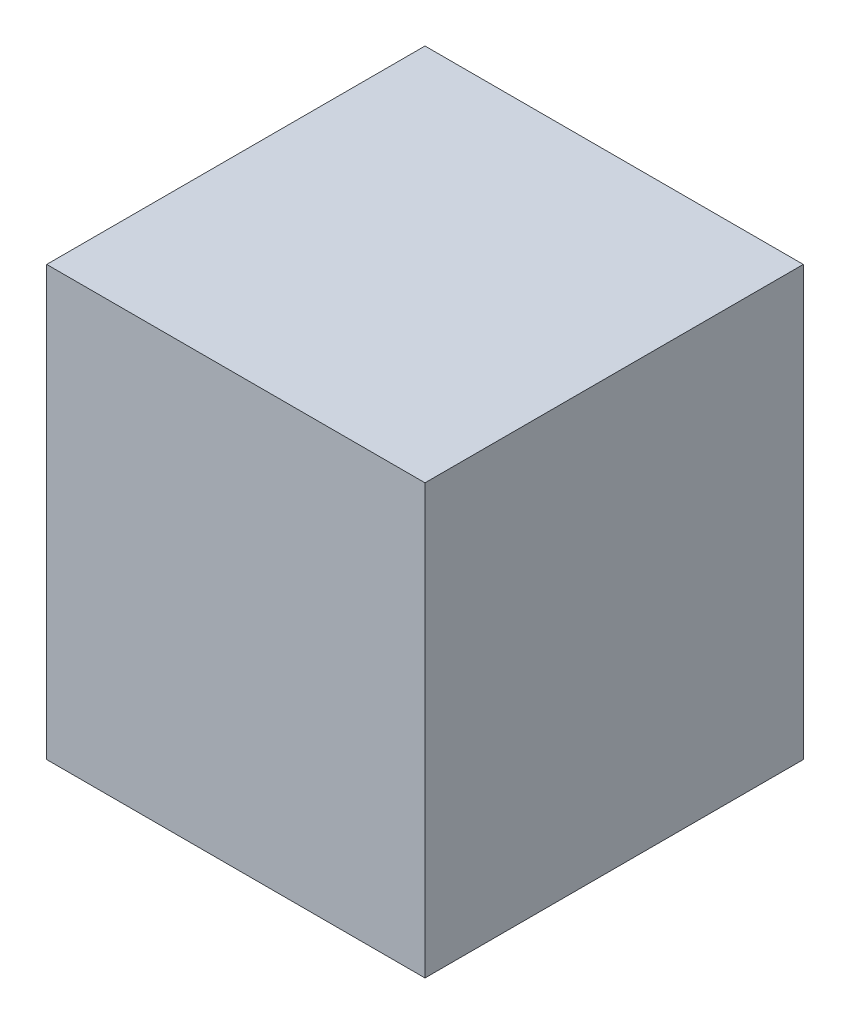
ISO-10303-21;
HEADER;
FILE_DESCRIPTION(('STEP AP214'),'2;1');
FILE_NAME('part.step','',(''),(''),'','','');
FILE_SCHEMA(('AUTOMOTIVE_DESIGN { 1 0 10303 214 1 1 1 1 }'));
ENDSEC;
DATA;
#1=APPLICATION_CONTEXT('core data for automotive mechanical design processes');
#2=APPLICATION_PROTOCOL_DEFINITION('international standard','automotive_design',2000,#1);
#3=PRODUCT_CONTEXT('',#1,'mechanical');
#4=PRODUCT('Part','Part','',(#3));
#5=PRODUCT_RELATED_PRODUCT_CATEGORY('part','',(#4));
#6=PRODUCT_DEFINITION_FORMATION('','',#4);
#7=PRODUCT_DEFINITION_CONTEXT('part definition',#1,'design');
#8=PRODUCT_DEFINITION('design','',#6,#7);
#9=PRODUCT_DEFINITION_SHAPE('','',#8);
#10=(LENGTH_UNIT() NAMED_UNIT(*) SI_UNIT(.MILLI.,.METRE.));
#11=(NAMED_UNIT(*) PLANE_ANGLE_UNIT() SI_UNIT($,.RADIAN.));
#12=(NAMED_UNIT(*) SI_UNIT($,.STERADIAN.) SOLID_ANGLE_UNIT());
#13=UNCERTAINTY_MEASURE_WITH_UNIT(LENGTH_MEASURE(1.E-05),#10,'distance_accuracy_value','');
#14=(GEOMETRIC_REPRESENTATION_CONTEXT(3) GLOBAL_UNCERTAINTY_ASSIGNED_CONTEXT((#13)) GLOBAL_UNIT_ASSIGNED_CONTEXT((#10,
#11,#12)) REPRESENTATION_CONTEXT('',''));
#15=CARTESIAN_POINT('',(0.,0.,0.));
#16=DIRECTION('',(0.,0.,1.));
#17=DIRECTION('',(1.,0.,0.));
#18=AXIS2_PLACEMENT_3D('',#15,#16,#17);
#19=CARTESIAN_POINT('',(2.5,2.834,2.5));
#20=DIRECTION('',(-1.,0.,0.));
#21=DIRECTION('',(0.,0.,1.));
#22=AXIS2_PLACEMENT_3D('',#19,#20,#21);
#23=PLANE('',#22);
#24=DIRECTION('',(0.,0.,-1.));
#25=VECTOR('',#24,1.);
#26=CARTESIAN_POINT('',(2.5,-2.834,2.5));
#27=LINE('',#26,#25);
#28=CARTESIAN_POINT('',(2.5,-2.834,2.5));
#29=VERTEX_POINT('',#28);
#30=CARTESIAN_POINT('',(2.5,-2.834,-2.5));
#31=VERTEX_POINT('',#30);
#32=EDGE_CURVE('E102',#29,#31,#27,.T.);
#33=ORIENTED_EDGE('',*,*,#32,.T.);
#34=DIRECTION('',(0.,-1.,0.));
#35=VECTOR('',#34,1.);
#36=CARTESIAN_POINT('',(2.5,2.834,-2.5));
#37=LINE('',#36,#35);
#38=CARTESIAN_POINT('',(2.5,2.834,-2.5));
#39=VERTEX_POINT('',#38);
#40=EDGE_CURVE('E11',#39,#31,#37,.T.);
#41=ORIENTED_EDGE('',*,*,#40,.F.);
#42=DIRECTION('',(0.,0.,-1.));
#43=VECTOR('',#42,1.);
#44=CARTESIAN_POINT('',(2.5,2.834,2.5));
#45=LINE('',#44,#43);
#46=CARTESIAN_POINT('',(2.5,2.834,2.5));
#47=VERTEX_POINT('',#46);
#48=EDGE_CURVE('E90',#47,#39,#45,.T.);
#49=ORIENTED_EDGE('',*,*,#48,.F.);
#50=DIRECTION('',(0.,-1.,0.));
#51=VECTOR('',#50,1.);
#52=CARTESIAN_POINT('',(2.5,2.834,2.5));
#53=LINE('',#52,#51);
#54=EDGE_CURVE('E98',#47,#29,#53,.T.);
#55=ORIENTED_EDGE('',*,*,#54,.T.);
#56=EDGE_LOOP('',(#33,#41,#49,#55));
#57=FACE_BOUND('',#56,.T.);
#58=ADVANCED_FACE('F39',(#57),#23,.F.);
#59=CARTESIAN_POINT('',(-2.5,2.834,-2.5));
#60=DIRECTION('',(0.,0.,1.));
#61=DIRECTION('',(1.,0.,0.));
#62=AXIS2_PLACEMENT_3D('',#59,#60,#61);
#63=PLANE('',#62);
#64=DIRECTION('',(-1.,0.,0.));
#65=VECTOR('',#64,1.);
#66=CARTESIAN_POINT('',(-2.5,-2.834,-2.5));
#67=LINE('',#66,#65);
#68=CARTESIAN_POINT('',(-2.5,-2.834,-2.5));
#69=VERTEX_POINT('',#68);
#70=EDGE_CURVE('E94',#31,#69,#67,.T.);
#71=ORIENTED_EDGE('',*,*,#70,.T.);
#72=DIRECTION('',(0.,-1.,0.));
#73=VECTOR('',#72,1.);
#74=CARTESIAN_POINT('',(-2.5,2.834,-2.5));
#75=LINE('',#74,#73);
#76=CARTESIAN_POINT('',(-2.5,2.834,-2.5));
#77=VERTEX_POINT('',#76);
#78=EDGE_CURVE('E47',#77,#69,#75,.T.);
#79=ORIENTED_EDGE('',*,*,#78,.F.);
#80=DIRECTION('',(-1.,0.,0.));
#81=VECTOR('',#80,1.);
#82=CARTESIAN_POINT('',(-2.5,2.834,-2.5));
#83=LINE('',#82,#81);
#84=EDGE_CURVE('E85',#39,#77,#83,.T.);
#85=ORIENTED_EDGE('',*,*,#84,.F.);
#86=ORIENTED_EDGE('',*,*,#40,.T.);
#87=EDGE_LOOP('',(#71,#79,#85,#86));
#88=FACE_BOUND('',#87,.T.);
#89=ADVANCED_FACE('F93',(#88),#63,.F.);
#90=CARTESIAN_POINT('',(-2.5,2.834,2.5));
#91=DIRECTION('',(1.,0.,0.));
#92=DIRECTION('',(0.,0.,-1.));
#93=AXIS2_PLACEMENT_3D('',#90,#91,#92);
#94=PLANE('',#93);
#95=DIRECTION('',(0.,0.,1.));
#96=VECTOR('',#95,1.);
#97=CARTESIAN_POINT('',(-2.5,-2.834,2.5));
#98=LINE('',#97,#96);
#99=CARTESIAN_POINT('',(-2.5,-2.834,2.5));
#100=VERTEX_POINT('',#99);
#101=EDGE_CURVE('E72',#69,#100,#98,.T.);
#102=ORIENTED_EDGE('',*,*,#101,.T.);
#103=DIRECTION('',(0.,-1.,0.));
#104=VECTOR('',#103,1.);
#105=CARTESIAN_POINT('',(-2.5,2.834,2.5));
#106=LINE('',#105,#104);
#107=CARTESIAN_POINT('',(-2.5,2.834,2.5));
#108=VERTEX_POINT('',#107);
#109=EDGE_CURVE('E95',#108,#100,#106,.T.);
#110=ORIENTED_EDGE('',*,*,#109,.F.);
#111=DIRECTION('',(0.,0.,1.));
#112=VECTOR('',#111,1.);
#113=CARTESIAN_POINT('',(-2.5,2.834,2.5));
#114=LINE('',#113,#112);
#115=EDGE_CURVE('E88',#77,#108,#114,.T.);
#116=ORIENTED_EDGE('',*,*,#115,.F.);
#117=ORIENTED_EDGE('',*,*,#78,.T.);
#118=EDGE_LOOP('',(#102,#110,#116,#117));
#119=FACE_BOUND('',#118,.T.);
#120=ADVANCED_FACE('F96',(#119),#94,.F.);
#121=CARTESIAN_POINT('',(-2.5,2.834,2.5));
#122=DIRECTION('',(0.,0.,-1.));
#123=DIRECTION('',(-1.,0.,0.));
#124=AXIS2_PLACEMENT_3D('',#121,#122,#123);
#125=PLANE('',#124);
#126=DIRECTION('',(1.,0.,0.));
#127=VECTOR('',#126,1.);
#128=CARTESIAN_POINT('',(-2.5,-2.834,2.5));
#129=LINE('',#128,#127);
#130=EDGE_CURVE('E78',#100,#29,#129,.T.);
#131=ORIENTED_EDGE('',*,*,#130,.T.);
#132=ORIENTED_EDGE('',*,*,#54,.F.);
#133=DIRECTION('',(1.,0.,0.));
#134=VECTOR('',#133,1.);
#135=CARTESIAN_POINT('',(-2.5,2.834,2.5));
#136=LINE('',#135,#134);
#137=EDGE_CURVE('E55',#108,#47,#136,.T.);
#138=ORIENTED_EDGE('',*,*,#137,.F.);
#139=ORIENTED_EDGE('',*,*,#109,.T.);
#140=EDGE_LOOP('',(#131,#132,#138,#139));
#141=FACE_BOUND('',#140,.T.);
#142=ADVANCED_FACE('F109',(#141),#125,.F.);
#143=CARTESIAN_POINT('',(0.,2.834,0.));
#144=DIRECTION('',(0.,-1.,0.));
#145=DIRECTION('',(0.,0.,-1.));
#146=AXIS2_PLACEMENT_3D('',#143,#144,#145);
#147=PLANE('',#146);
#148=ORIENTED_EDGE('',*,*,#48,.T.);
#149=ORIENTED_EDGE('',*,*,#84,.T.);
#150=ORIENTED_EDGE('',*,*,#115,.T.);
#151=ORIENTED_EDGE('',*,*,#137,.T.);
#152=EDGE_LOOP('',(#148,#149,#150,#151));
#153=FACE_BOUND('',#152,.T.);
#154=ADVANCED_FACE('F86',(#153),#147,.F.);
#155=CARTESIAN_POINT('',(0.,-2.834,0.));
#156=DIRECTION('',(0.,-1.,0.));
#157=DIRECTION('',(0.,0.,-1.));
#158=AXIS2_PLACEMENT_3D('',#155,#156,#157);
#159=PLANE('',#158);
#160=ORIENTED_EDGE('',*,*,#32,.F.);
#161=ORIENTED_EDGE('',*,*,#130,.F.);
#162=ORIENTED_EDGE('',*,*,#101,.F.);
#163=ORIENTED_EDGE('',*,*,#70,.F.);
#164=EDGE_LOOP('',(#160,#161,#162,#163));
#165=FACE_BOUND('',#164,.T.);
#166=ADVANCED_FACE('F112',(#165),#159,.T.);
#167=CLOSED_SHELL('',(#58,#89,#120,#142,#154,#166));
#168=MANIFOLD_SOLID_BREP('B2',#167);
#169=ADVANCED_BREP_SHAPE_REPRESENTATION('',(#18,#168),#14);
#170=SHAPE_DEFINITION_REPRESENTATION(#9,#169);
ENDSEC;
END-ISO-10303-21;
